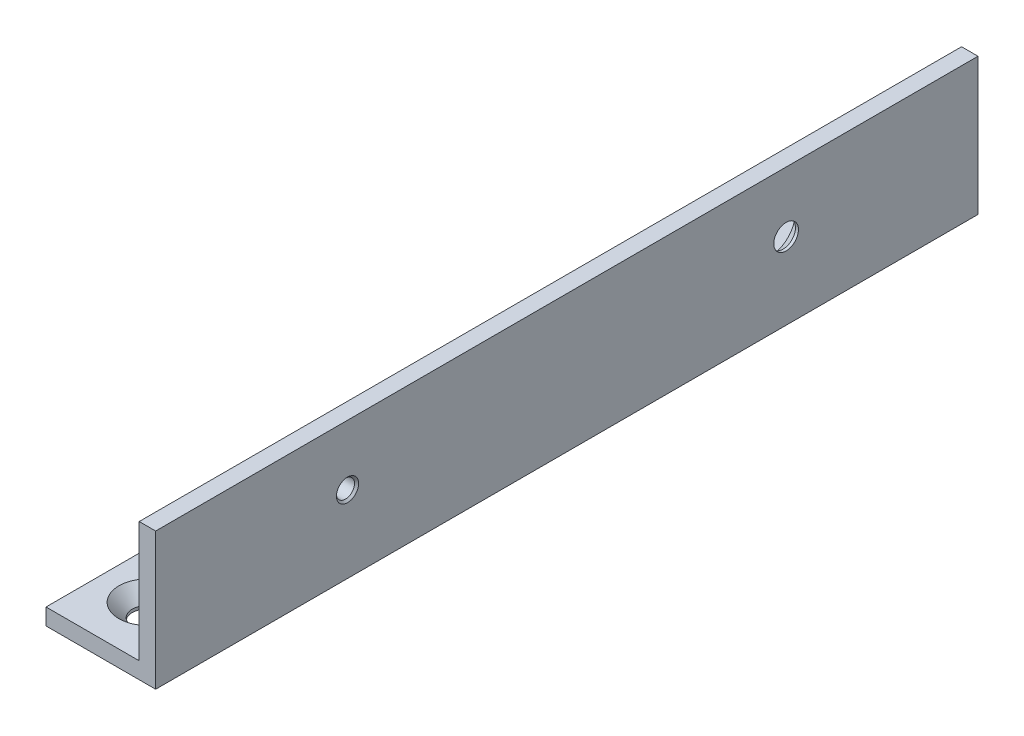
ISO-10303-21;
HEADER;
FILE_DESCRIPTION(('STEP AP214'),'2;1');
FILE_NAME('part.step','',(''),(''),'','','');
FILE_SCHEMA(('AUTOMOTIVE_DESIGN { 1 0 10303 214 1 1 1 1 }'));
ENDSEC;
DATA;
#1=APPLICATION_CONTEXT('core data for automotive mechanical design processes');
#2=APPLICATION_PROTOCOL_DEFINITION('international standard','automotive_design',2000,#1);
#3=PRODUCT_CONTEXT('',#1,'mechanical');
#4=PRODUCT('Part','Part','',(#3));
#5=PRODUCT_RELATED_PRODUCT_CATEGORY('part','',(#4));
#6=PRODUCT_DEFINITION_FORMATION('','',#4);
#7=PRODUCT_DEFINITION_CONTEXT('part definition',#1,'design');
#8=PRODUCT_DEFINITION('design','',#6,#7);
#9=PRODUCT_DEFINITION_SHAPE('','',#8);
#10=(LENGTH_UNIT() NAMED_UNIT(*) SI_UNIT(.MILLI.,.METRE.));
#11=(NAMED_UNIT(*) PLANE_ANGLE_UNIT() SI_UNIT($,.RADIAN.));
#12=(NAMED_UNIT(*) SI_UNIT($,.STERADIAN.) SOLID_ANGLE_UNIT());
#13=UNCERTAINTY_MEASURE_WITH_UNIT(LENGTH_MEASURE(1.E-05),#10,'distance_accuracy_value','');
#14=(GEOMETRIC_REPRESENTATION_CONTEXT(3) GLOBAL_UNCERTAINTY_ASSIGNED_CONTEXT((#13)) GLOBAL_UNIT_ASSIGNED_CONTEXT((#10,
#11,#12)) REPRESENTATION_CONTEXT('',''));
#15=CARTESIAN_POINT('',(0.,0.,0.));
#16=DIRECTION('',(0.,0.,1.));
#17=DIRECTION('',(1.,0.,0.));
#18=AXIS2_PLACEMENT_3D('',#15,#16,#17);
#19=CARTESIAN_POINT('',(-3.,25.,150.));
#20=DIRECTION('',(1.,0.,0.));
#21=DIRECTION('',(0.,0.,-1.));
#22=AXIS2_PLACEMENT_3D('',#19,#20,#21);
#23=PLANE('',#22);
#24=CARTESIAN_POINT('',(-3.,14.,115.));
#25=DIRECTION('',(1.,0.,0.));
#26=DIRECTION('',(0.,0.,-1.));
#27=AXIS2_PLACEMENT_3D('',#24,#25,#26);
#28=CIRCLE('',#27,2.025);
#29=CARTESIAN_POINT('',(-3.,14.,112.975));
#30=VERTEX_POINT('',#29);
#31=EDGE_CURVE('E177',#30,#30,#28,.T.);
#32=ORIENTED_EDGE('',*,*,#31,.T.);
#33=EDGE_LOOP('',(#32));
#34=FACE_BOUND('',#33,.T.);
#35=CARTESIAN_POINT('',(-3.,14.,35.));
#36=DIRECTION('',(-1.,0.,0.));
#37=DIRECTION('',(0.,0.,1.));
#38=AXIS2_PLACEMENT_3D('',#35,#36,#37);
#39=CIRCLE('',#38,4.7);
#40=CARTESIAN_POINT('',(-3.,14.,39.7));
#41=VERTEX_POINT('',#40);
#42=EDGE_CURVE('E180',#41,#41,#39,.T.);
#43=ORIENTED_EDGE('',*,*,#42,.F.);
#44=EDGE_LOOP('',(#43));
#45=FACE_BOUND('',#44,.T.);
#46=DIRECTION('',(0.,-1.,0.));
#47=VECTOR('',#46,1.);
#48=CARTESIAN_POINT('',(-3.,25.,0.));
#49=LINE('',#48,#47);
#50=CARTESIAN_POINT('',(-3.,25.,0.));
#51=VERTEX_POINT('',#50);
#52=CARTESIAN_POINT('',(-3.,3.00000000000001,0.));
#53=VERTEX_POINT('',#52);
#54=EDGE_CURVE('E130',#51,#53,#49,.T.);
#55=ORIENTED_EDGE('',*,*,#54,.T.);
#56=DIRECTION('',(0.,0.,-1.));
#57=VECTOR('',#56,1.);
#58=CARTESIAN_POINT('',(-3.,3.00000000000001,150.));
#59=LINE('',#58,#57);
#60=CARTESIAN_POINT('',(-3.,3.00000000000001,150.));
#61=VERTEX_POINT('',#60);
#62=EDGE_CURVE('E13',#61,#53,#59,.T.);
#63=ORIENTED_EDGE('',*,*,#62,.F.);
#64=DIRECTION('',(0.,-1.,0.));
#65=VECTOR('',#64,1.);
#66=CARTESIAN_POINT('',(-3.,25.,150.));
#67=LINE('',#66,#65);
#68=CARTESIAN_POINT('',(-3.,25.,150.));
#69=VERTEX_POINT('',#68);
#70=EDGE_CURVE('E142',#69,#61,#67,.T.);
#71=ORIENTED_EDGE('',*,*,#70,.F.);
#72=DIRECTION('',(0.,0.,-1.));
#73=VECTOR('',#72,1.);
#74=CARTESIAN_POINT('',(-3.,25.,150.));
#75=LINE('',#74,#73);
#76=EDGE_CURVE('E126',#69,#51,#75,.T.);
#77=ORIENTED_EDGE('',*,*,#76,.T.);
#78=EDGE_LOOP('',(#55,#63,#71,#77));
#79=FACE_BOUND('',#78,.T.);
#80=ADVANCED_FACE('F47',(#34,#45,#79),#23,.F.);
#81=CARTESIAN_POINT('',(-3.,3.00000000000001,150.));
#82=DIRECTION('',(0.,-1.,0.));
#83=DIRECTION('',(1.,0.,0.));
#84=AXIS2_PLACEMENT_3D('',#81,#82,#83);
#85=PLANE('',#84);
#86=CARTESIAN_POINT('',(-11.5,3.00000000000004,75.));
#87=DIRECTION('',(0.,1.,0.));
#88=DIRECTION('',(0.,0.,1.));
#89=AXIS2_PLACEMENT_3D('',#86,#87,#88);
#90=CIRCLE('',#89,5.2);
#91=CARTESIAN_POINT('',(-11.5,3.00000000000004,80.2));
#92=VERTEX_POINT('',#91);
#93=EDGE_CURVE('E223',#92,#92,#90,.T.);
#94=ORIENTED_EDGE('',*,*,#93,.F.);
#95=EDGE_LOOP('',(#94));
#96=FACE_BOUND('',#95,.T.);
#97=CARTESIAN_POINT('',(-11.5,3.00000000000004,140.));
#98=DIRECTION('',(0.,1.,0.));
#99=DIRECTION('',(0.,0.,1.));
#100=AXIS2_PLACEMENT_3D('',#97,#98,#99);
#101=CIRCLE('',#100,5.2);
#102=CARTESIAN_POINT('',(-11.5,3.00000000000004,145.2));
#103=VERTEX_POINT('',#102);
#104=EDGE_CURVE('E214',#103,#103,#101,.T.);
#105=ORIENTED_EDGE('',*,*,#104,.F.);
#106=EDGE_LOOP('',(#105));
#107=FACE_BOUND('',#106,.T.);
#108=CARTESIAN_POINT('',(-11.5,3.00000000000004,10.));
#109=DIRECTION('',(0.,1.,0.));
#110=DIRECTION('',(0.,0.,1.));
#111=AXIS2_PLACEMENT_3D('',#108,#109,#110);
#112=CIRCLE('',#111,5.2);
#113=CARTESIAN_POINT('',(-11.5,3.00000000000004,15.2));
#114=VERTEX_POINT('',#113);
#115=EDGE_CURVE('E205',#114,#114,#112,.T.);
#116=ORIENTED_EDGE('',*,*,#115,.F.);
#117=EDGE_LOOP('',(#116));
#118=FACE_BOUND('',#117,.T.);
#119=DIRECTION('',(-1.,0.,0.));
#120=VECTOR('',#119,1.);
#121=CARTESIAN_POINT('',(-3.,3.00000000000001,0.));
#122=LINE('',#121,#120);
#123=CARTESIAN_POINT('',(-20.,3.00000000000006,0.));
#124=VERTEX_POINT('',#123);
#125=EDGE_CURVE('E133',#53,#124,#122,.T.);
#126=ORIENTED_EDGE('',*,*,#125,.T.);
#127=DIRECTION('',(0.,0.,-1.));
#128=VECTOR('',#127,1.);
#129=CARTESIAN_POINT('',(-20.,3.00000000000006,150.));
#130=LINE('',#129,#128);
#131=CARTESIAN_POINT('',(-20.,3.00000000000006,150.));
#132=VERTEX_POINT('',#131);
#133=EDGE_CURVE('E56',#132,#124,#130,.T.);
#134=ORIENTED_EDGE('',*,*,#133,.F.);
#135=DIRECTION('',(-1.,0.,0.));
#136=VECTOR('',#135,1.);
#137=CARTESIAN_POINT('',(-3.,3.00000000000001,150.));
#138=LINE('',#137,#136);
#139=EDGE_CURVE('E97',#61,#132,#138,.T.);
#140=ORIENTED_EDGE('',*,*,#139,.F.);
#141=ORIENTED_EDGE('',*,*,#62,.T.);
#142=EDGE_LOOP('',(#126,#134,#140,#141));
#143=FACE_BOUND('',#142,.T.);
#144=ADVANCED_FACE('F168',(#96,#107,#118,#143),#85,.F.);
#145=CARTESIAN_POINT('',(-20.,3.00000000000006,150.));
#146=DIRECTION('',(1.,0.,0.));
#147=DIRECTION('',(0.,1.,0.));
#148=AXIS2_PLACEMENT_3D('',#145,#146,#147);
#149=PLANE('',#148);
#150=DIRECTION('',(0.,-1.,0.));
#151=VECTOR('',#150,1.);
#152=CARTESIAN_POINT('',(-20.,3.00000000000006,0.));
#153=LINE('',#152,#151);
#154=CARTESIAN_POINT('',(-20.,0.,0.));
#155=VERTEX_POINT('',#154);
#156=EDGE_CURVE('E135',#124,#155,#153,.T.);
#157=ORIENTED_EDGE('',*,*,#156,.T.);
#158=DIRECTION('',(0.,0.,-1.));
#159=VECTOR('',#158,1.);
#160=CARTESIAN_POINT('',(-20.,0.,150.));
#161=LINE('',#160,#159);
#162=CARTESIAN_POINT('',(-20.,0.,150.));
#163=VERTEX_POINT('',#162);
#164=EDGE_CURVE('E116',#163,#155,#161,.T.);
#165=ORIENTED_EDGE('',*,*,#164,.F.);
#166=DIRECTION('',(0.,-1.,0.));
#167=VECTOR('',#166,1.);
#168=CARTESIAN_POINT('',(-20.,3.00000000000006,150.));
#169=LINE('',#168,#167);
#170=EDGE_CURVE('E121',#132,#163,#169,.T.);
#171=ORIENTED_EDGE('',*,*,#170,.F.);
#172=ORIENTED_EDGE('',*,*,#133,.T.);
#173=EDGE_LOOP('',(#157,#165,#171,#172));
#174=FACE_BOUND('',#173,.T.);
#175=ADVANCED_FACE('F149',(#174),#149,.F.);
#176=CARTESIAN_POINT('',(0.,0.,150.));
#177=DIRECTION('',(0.,-1.,0.));
#178=DIRECTION('',(1.,0.,0.));
#179=AXIS2_PLACEMENT_3D('',#176,#177,#178);
#180=PLANE('',#179);
#181=CARTESIAN_POINT('',(-11.5,0.,75.));
#182=DIRECTION('',(0.,1.,0.));
#183=DIRECTION('',(0.,0.,1.));
#184=AXIS2_PLACEMENT_3D('',#181,#182,#183);
#185=CIRCLE('',#184,2.75);
#186=CARTESIAN_POINT('',(-11.5,0.,77.75));
#187=VERTEX_POINT('',#186);
#188=EDGE_CURVE('E217',#187,#187,#185,.T.);
#189=ORIENTED_EDGE('',*,*,#188,.T.);
#190=EDGE_LOOP('',(#189));
#191=FACE_BOUND('',#190,.T.);
#192=CARTESIAN_POINT('',(-11.5,0.,140.));
#193=DIRECTION('',(0.,1.,0.));
#194=DIRECTION('',(0.,0.,1.));
#195=AXIS2_PLACEMENT_3D('',#192,#193,#194);
#196=CIRCLE('',#195,2.75);
#197=CARTESIAN_POINT('',(-11.5,0.,142.75));
#198=VERTEX_POINT('',#197);
#199=EDGE_CURVE('E208',#198,#198,#196,.T.);
#200=ORIENTED_EDGE('',*,*,#199,.T.);
#201=EDGE_LOOP('',(#200));
#202=FACE_BOUND('',#201,.T.);
#203=CARTESIAN_POINT('',(-11.5,0.,10.));
#204=DIRECTION('',(0.,1.,0.));
#205=DIRECTION('',(0.,0.,1.));
#206=AXIS2_PLACEMENT_3D('',#203,#204,#205);
#207=CIRCLE('',#206,2.75);
#208=CARTESIAN_POINT('',(-11.5,0.,12.75));
#209=VERTEX_POINT('',#208);
#210=EDGE_CURVE('E199',#209,#209,#207,.T.);
#211=ORIENTED_EDGE('',*,*,#210,.T.);
#212=EDGE_LOOP('',(#211));
#213=FACE_BOUND('',#212,.T.);
#214=DIRECTION('',(-1.,0.,0.));
#215=VECTOR('',#214,1.);
#216=CARTESIAN_POINT('',(0.,0.,0.));
#217=LINE('',#216,#215);
#218=CARTESIAN_POINT('',(0.,0.,0.));
#219=VERTEX_POINT('',#218);
#220=EDGE_CURVE('E111',#219,#155,#217,.T.);
#221=ORIENTED_EDGE('',*,*,#220,.F.);
#222=DIRECTION('',(0.,0.,-1.));
#223=VECTOR('',#222,1.);
#224=CARTESIAN_POINT('',(0.,0.,150.));
#225=LINE('',#224,#223);
#226=CARTESIAN_POINT('',(0.,0.,150.));
#227=VERTEX_POINT('',#226);
#228=EDGE_CURVE('E106',#227,#219,#225,.T.);
#229=ORIENTED_EDGE('',*,*,#228,.F.);
#230=DIRECTION('',(-1.,0.,0.));
#231=VECTOR('',#230,1.);
#232=CARTESIAN_POINT('',(0.,0.,150.));
#233=LINE('',#232,#231);
#234=EDGE_CURVE('E109',#227,#163,#233,.T.);
#235=ORIENTED_EDGE('',*,*,#234,.T.);
#236=ORIENTED_EDGE('',*,*,#164,.T.);
#237=EDGE_LOOP('',(#221,#229,#235,#236));
#238=FACE_BOUND('',#237,.T.);
#239=ADVANCED_FACE('F108',(#191,#202,#213,#238),#180,.T.);
#240=CARTESIAN_POINT('',(0.,25.,150.));
#241=DIRECTION('',(1.,0.,0.));
#242=DIRECTION('',(0.,1.,0.));
#243=AXIS2_PLACEMENT_3D('',#240,#241,#242);
#244=PLANE('',#243);
#245=CARTESIAN_POINT('',(0.,14.,115.));
#246=DIRECTION('',(1.,0.,0.));
#247=DIRECTION('',(0.,0.,-1.));
#248=AXIS2_PLACEMENT_3D('',#245,#246,#247);
#249=CIRCLE('',#248,2.025);
#250=CARTESIAN_POINT('',(0.,14.,112.975));
#251=VERTEX_POINT('',#250);
#252=EDGE_CURVE('E195',#251,#251,#249,.T.);
#253=ORIENTED_EDGE('',*,*,#252,.F.);
#254=EDGE_LOOP('',(#253));
#255=FACE_BOUND('',#254,.T.);
#256=CARTESIAN_POINT('',(0.,14.,35.));
#257=DIRECTION('',(1.,0.,0.));
#258=DIRECTION('',(0.,1.,0.));
#259=AXIS2_PLACEMENT_3D('',#256,#257,#258);
#260=CIRCLE('',#259,2.25);
#261=CARTESIAN_POINT('',(0.,16.25,35.));
#262=VERTEX_POINT('',#261);
#263=EDGE_CURVE('E50',#262,#262,#260,.T.);
#264=ORIENTED_EDGE('',*,*,#263,.F.);
#265=EDGE_LOOP('',(#264));
#266=FACE_BOUND('',#265,.T.);
#267=DIRECTION('',(0.,-1.,0.));
#268=VECTOR('',#267,1.);
#269=CARTESIAN_POINT('',(0.,25.,0.));
#270=LINE('',#269,#268);
#271=CARTESIAN_POINT('',(0.,25.,0.));
#272=VERTEX_POINT('',#271);
#273=EDGE_CURVE('E139',#272,#219,#270,.T.);
#274=ORIENTED_EDGE('',*,*,#273,.F.);
#275=DIRECTION('',(0.,0.,-1.));
#276=VECTOR('',#275,1.);
#277=CARTESIAN_POINT('',(0.,25.,150.));
#278=LINE('',#277,#276);
#279=CARTESIAN_POINT('',(0.,25.,150.));
#280=VERTEX_POINT('',#279);
#281=EDGE_CURVE('E86',#280,#272,#278,.T.);
#282=ORIENTED_EDGE('',*,*,#281,.F.);
#283=DIRECTION('',(0.,-1.,0.));
#284=VECTOR('',#283,1.);
#285=CARTESIAN_POINT('',(0.,25.,150.));
#286=LINE('',#285,#284);
#287=EDGE_CURVE('E119',#280,#227,#286,.T.);
#288=ORIENTED_EDGE('',*,*,#287,.T.);
#289=ORIENTED_EDGE('',*,*,#228,.T.);
#290=EDGE_LOOP('',(#274,#282,#288,#289));
#291=FACE_BOUND('',#290,.T.);
#292=ADVANCED_FACE('F124',(#255,#266,#291),#244,.T.);
#293=CARTESIAN_POINT('',(0.,25.,150.));
#294=DIRECTION('',(0.,-1.,0.));
#295=DIRECTION('',(0.,0.,-1.));
#296=AXIS2_PLACEMENT_3D('',#293,#294,#295);
#297=PLANE('',#296);
#298=DIRECTION('',(-1.,0.,0.));
#299=VECTOR('',#298,1.);
#300=CARTESIAN_POINT('',(0.,25.,0.));
#301=LINE('',#300,#299);
#302=EDGE_CURVE('E89',#272,#51,#301,.T.);
#303=ORIENTED_EDGE('',*,*,#302,.T.);
#304=ORIENTED_EDGE('',*,*,#76,.F.);
#305=DIRECTION('',(-1.,0.,0.));
#306=VECTOR('',#305,1.);
#307=CARTESIAN_POINT('',(0.,25.,150.));
#308=LINE('',#307,#306);
#309=EDGE_CURVE('E64',#280,#69,#308,.T.);
#310=ORIENTED_EDGE('',*,*,#309,.F.);
#311=ORIENTED_EDGE('',*,*,#281,.T.);
#312=EDGE_LOOP('',(#303,#304,#310,#311));
#313=FACE_BOUND('',#312,.T.);
#314=ADVANCED_FACE('F156',(#313),#297,.F.);
#315=CARTESIAN_POINT('',(0.,0.,150.));
#316=DIRECTION('',(0.,0.,-1.));
#317=DIRECTION('',(-1.,0.,0.));
#318=AXIS2_PLACEMENT_3D('',#315,#316,#317);
#319=PLANE('',#318);
#320=ORIENTED_EDGE('',*,*,#70,.T.);
#321=ORIENTED_EDGE('',*,*,#139,.T.);
#322=ORIENTED_EDGE('',*,*,#170,.T.);
#323=ORIENTED_EDGE('',*,*,#234,.F.);
#324=ORIENTED_EDGE('',*,*,#287,.F.);
#325=ORIENTED_EDGE('',*,*,#309,.T.);
#326=EDGE_LOOP('',(#320,#321,#322,#323,#324,#325));
#327=FACE_BOUND('',#326,.T.);
#328=ADVANCED_FACE('F118',(#327),#319,.F.);
#329=CARTESIAN_POINT('',(0.,0.,0.));
#330=DIRECTION('',(0.,0.,-1.));
#331=DIRECTION('',(-1.,0.,0.));
#332=AXIS2_PLACEMENT_3D('',#329,#330,#331);
#333=PLANE('',#332);
#334=ORIENTED_EDGE('',*,*,#54,.F.);
#335=ORIENTED_EDGE('',*,*,#302,.F.);
#336=ORIENTED_EDGE('',*,*,#273,.T.);
#337=ORIENTED_EDGE('',*,*,#220,.T.);
#338=ORIENTED_EDGE('',*,*,#156,.F.);
#339=ORIENTED_EDGE('',*,*,#125,.F.);
#340=EDGE_LOOP('',(#334,#335,#336,#337,#338,#339));
#341=FACE_BOUND('',#340,.T.);
#342=ADVANCED_FACE('F152',(#341),#333,.T.);
#343=CARTESIAN_POINT('',(-3.,14.,35.));
#344=DIRECTION('',(-1.,0.,0.));
#345=DIRECTION('',(0.,0.,1.));
#346=AXIS2_PLACEMENT_3D('',#343,#344,#345);
#347=CYLINDRICAL_SURFACE('',#346,2.25);
#348=ORIENTED_EDGE('',*,*,#263,.T.);
#349=EDGE_LOOP('',(#348));
#350=FACE_BOUND('',#349,.T.);
#351=CARTESIAN_POINT('',(-0.550000000000004,14.,35.));
#352=DIRECTION('',(-1.,0.,0.));
#353=DIRECTION('',(0.,0.,1.));
#354=AXIS2_PLACEMENT_3D('',#351,#352,#353);
#355=CIRCLE('',#354,2.25);
#356=CARTESIAN_POINT('',(-0.550000000000004,14.,37.25));
#357=VERTEX_POINT('',#356);
#358=EDGE_CURVE('E182',#357,#357,#355,.T.);
#359=ORIENTED_EDGE('',*,*,#358,.T.);
#360=EDGE_LOOP('',(#359));
#361=FACE_BOUND('',#360,.T.);
#362=ADVANCED_FACE('F266',(#350,#361),#347,.F.);
#363=CARTESIAN_POINT('',(-3.,14.,35.));
#364=DIRECTION('',(-1.,0.,0.));
#365=DIRECTION('',(0.,0.,1.));
#366=AXIS2_PLACEMENT_3D('',#363,#364,#365);
#367=CONICAL_SURFACE('',#366,4.7,0.785398163397449);
#368=ORIENTED_EDGE('',*,*,#358,.F.);
#369=EDGE_LOOP('',(#368));
#370=FACE_BOUND('',#369,.T.);
#371=ORIENTED_EDGE('',*,*,#42,.T.);
#372=EDGE_LOOP('',(#371));
#373=FACE_BOUND('',#372,.T.);
#374=ADVANCED_FACE('F262',(#370,#373),#367,.F.);
#375=CARTESIAN_POINT('',(-2.625,14.,115.));
#376=DIRECTION('',(-1.,0.,0.));
#377=DIRECTION('',(0.,0.,1.));
#378=AXIS2_PLACEMENT_3D('',#375,#376,#377);
#379=CONICAL_SURFACE('',#378,1.65,0.785398163397448);
#380=ORIENTED_EDGE('',*,*,#31,.F.);
#381=EDGE_LOOP('',(#380));
#382=FACE_BOUND('',#381,.T.);
#383=CARTESIAN_POINT('',(-2.625,14.,115.));
#384=DIRECTION('',(1.,0.,0.));
#385=DIRECTION('',(0.,0.,-1.));
#386=AXIS2_PLACEMENT_3D('',#383,#384,#385);
#387=CIRCLE('',#386,1.65);
#388=CARTESIAN_POINT('',(-2.625,14.,113.35));
#389=VERTEX_POINT('',#388);
#390=EDGE_CURVE('E183',#389,#389,#387,.T.);
#391=ORIENTED_EDGE('',*,*,#390,.T.);
#392=EDGE_LOOP('',(#391));
#393=FACE_BOUND('',#392,.T.);
#394=ADVANCED_FACE('F258',(#382,#393),#379,.F.);
#395=CARTESIAN_POINT('',(0.,14.,115.));
#396=DIRECTION('',(1.,0.,0.));
#397=DIRECTION('',(0.,0.,-1.));
#398=AXIS2_PLACEMENT_3D('',#395,#396,#397);
#399=CYLINDRICAL_SURFACE('',#398,1.65);
#400=ORIENTED_EDGE('',*,*,#390,.F.);
#401=EDGE_LOOP('',(#400));
#402=FACE_BOUND('',#401,.T.);
#403=CARTESIAN_POINT('',(-0.374999999999999,14.,115.));
#404=DIRECTION('',(1.,0.,0.));
#405=DIRECTION('',(0.,0.,-1.));
#406=AXIS2_PLACEMENT_3D('',#403,#404,#405);
#407=CIRCLE('',#406,1.65);
#408=CARTESIAN_POINT('',(-0.374999999999999,14.,113.35));
#409=VERTEX_POINT('',#408);
#410=EDGE_CURVE('E188',#409,#409,#407,.T.);
#411=ORIENTED_EDGE('',*,*,#410,.T.);
#412=EDGE_LOOP('',(#411));
#413=FACE_BOUND('',#412,.T.);
#414=ADVANCED_FACE('F254',(#402,#413),#399,.F.);
#415=CARTESIAN_POINT('',(0.,14.,115.));
#416=DIRECTION('',(1.,0.,0.));
#417=DIRECTION('',(0.,0.,-1.));
#418=AXIS2_PLACEMENT_3D('',#415,#416,#417);
#419=CONICAL_SURFACE('',#418,2.025,0.785398163397451);
#420=ORIENTED_EDGE('',*,*,#410,.F.);
#421=EDGE_LOOP('',(#420));
#422=FACE_BOUND('',#421,.T.);
#423=ORIENTED_EDGE('',*,*,#252,.T.);
#424=EDGE_LOOP('',(#423));
#425=FACE_BOUND('',#424,.T.);
#426=ADVANCED_FACE('F246',(#422,#425),#419,.F.);
#427=CARTESIAN_POINT('',(-11.5,3.00000000000004,10.));
#428=DIRECTION('',(0.,1.,0.));
#429=DIRECTION('',(0.,0.,1.));
#430=AXIS2_PLACEMENT_3D('',#427,#428,#429);
#431=CYLINDRICAL_SURFACE('',#430,2.75);
#432=ORIENTED_EDGE('',*,*,#210,.F.);
#433=EDGE_LOOP('',(#432));
#434=FACE_BOUND('',#433,.T.);
#435=CARTESIAN_POINT('',(-11.5,0.550000000000037,10.));
#436=DIRECTION('',(0.,1.,0.));
#437=DIRECTION('',(0.,0.,1.));
#438=AXIS2_PLACEMENT_3D('',#435,#436,#437);
#439=CIRCLE('',#438,2.75);
#440=CARTESIAN_POINT('',(-11.5,0.550000000000037,12.75));
#441=VERTEX_POINT('',#440);
#442=EDGE_CURVE('E202',#441,#441,#439,.T.);
#443=ORIENTED_EDGE('',*,*,#442,.T.);
#444=EDGE_LOOP('',(#443));
#445=FACE_BOUND('',#444,.T.);
#446=ADVANCED_FACE('F236',(#434,#445),#431,.F.);
#447=CARTESIAN_POINT('',(-11.5,3.00000000000004,10.));
#448=DIRECTION('',(0.,1.,0.));
#449=DIRECTION('',(0.,0.,1.));
#450=AXIS2_PLACEMENT_3D('',#447,#448,#449);
#451=CONICAL_SURFACE('',#450,5.2,0.785398163397449);
#452=ORIENTED_EDGE('',*,*,#442,.F.);
#453=EDGE_LOOP('',(#452));
#454=FACE_BOUND('',#453,.T.);
#455=ORIENTED_EDGE('',*,*,#115,.T.);
#456=EDGE_LOOP('',(#455));
#457=FACE_BOUND('',#456,.T.);
#458=ADVANCED_FACE('F233',(#454,#457),#451,.F.);
#459=CARTESIAN_POINT('',(-11.5,3.00000000000004,140.));
#460=DIRECTION('',(0.,1.,0.));
#461=DIRECTION('',(0.,0.,1.));
#462=AXIS2_PLACEMENT_3D('',#459,#460,#461);
#463=CYLINDRICAL_SURFACE('',#462,2.75);
#464=ORIENTED_EDGE('',*,*,#199,.F.);
#465=EDGE_LOOP('',(#464));
#466=FACE_BOUND('',#465,.T.);
#467=CARTESIAN_POINT('',(-11.5,0.550000000000037,140.));
#468=DIRECTION('',(0.,1.,0.));
#469=DIRECTION('',(0.,0.,1.));
#470=AXIS2_PLACEMENT_3D('',#467,#468,#469);
#471=CIRCLE('',#470,2.75);
#472=CARTESIAN_POINT('',(-11.5,0.550000000000037,142.75));
#473=VERTEX_POINT('',#472);
#474=EDGE_CURVE('E211',#473,#473,#471,.T.);
#475=ORIENTED_EDGE('',*,*,#474,.T.);
#476=EDGE_LOOP('',(#475));
#477=FACE_BOUND('',#476,.T.);
#478=ADVANCED_FACE('F235',(#466,#477),#463,.F.);
#479=CARTESIAN_POINT('',(-11.5,3.00000000000004,140.));
#480=DIRECTION('',(0.,1.,0.));
#481=DIRECTION('',(0.,0.,1.));
#482=AXIS2_PLACEMENT_3D('',#479,#480,#481);
#483=CONICAL_SURFACE('',#482,5.2,0.785398163397449);
#484=ORIENTED_EDGE('',*,*,#474,.F.);
#485=EDGE_LOOP('',(#484));
#486=FACE_BOUND('',#485,.T.);
#487=ORIENTED_EDGE('',*,*,#104,.T.);
#488=EDGE_LOOP('',(#487));
#489=FACE_BOUND('',#488,.T.);
#490=ADVANCED_FACE('F243',(#486,#489),#483,.F.);
#491=CARTESIAN_POINT('',(-11.5,3.00000000000004,75.));
#492=DIRECTION('',(0.,1.,0.));
#493=DIRECTION('',(0.,0.,1.));
#494=AXIS2_PLACEMENT_3D('',#491,#492,#493);
#495=CYLINDRICAL_SURFACE('',#494,2.75);
#496=ORIENTED_EDGE('',*,*,#188,.F.);
#497=EDGE_LOOP('',(#496));
#498=FACE_BOUND('',#497,.T.);
#499=CARTESIAN_POINT('',(-11.5,0.550000000000037,75.));
#500=DIRECTION('',(0.,1.,0.));
#501=DIRECTION('',(0.,0.,1.));
#502=AXIS2_PLACEMENT_3D('',#499,#500,#501);
#503=CIRCLE('',#502,2.75);
#504=CARTESIAN_POINT('',(-11.5,0.550000000000037,77.75));
#505=VERTEX_POINT('',#504);
#506=EDGE_CURVE('E220',#505,#505,#503,.T.);
#507=ORIENTED_EDGE('',*,*,#506,.T.);
#508=EDGE_LOOP('',(#507));
#509=FACE_BOUND('',#508,.T.);
#510=ADVANCED_FACE('F324',(#498,#509),#495,.F.);
#511=CARTESIAN_POINT('',(-11.5,3.00000000000004,75.));
#512=DIRECTION('',(0.,1.,0.));
#513=DIRECTION('',(0.,0.,1.));
#514=AXIS2_PLACEMENT_3D('',#511,#512,#513);
#515=CONICAL_SURFACE('',#514,5.2,0.785398163397449);
#516=ORIENTED_EDGE('',*,*,#506,.F.);
#517=EDGE_LOOP('',(#516));
#518=FACE_BOUND('',#517,.T.);
#519=ORIENTED_EDGE('',*,*,#93,.T.);
#520=EDGE_LOOP('',(#519));
#521=FACE_BOUND('',#520,.T.);
#522=ADVANCED_FACE('F227',(#518,#521),#515,.F.);
#523=CLOSED_SHELL('',(#80,#144,#175,#239,#292,#314,#328,#342,#362,#374,#394,#414,#426,#446,#458,
#478,#490,#510,#522));
#524=MANIFOLD_SOLID_BREP('B2',#523);
#525=ADVANCED_BREP_SHAPE_REPRESENTATION('',(#18,#524),#14);
#526=SHAPE_DEFINITION_REPRESENTATION(#9,#525);
ENDSEC;
END-ISO-10303-21;
